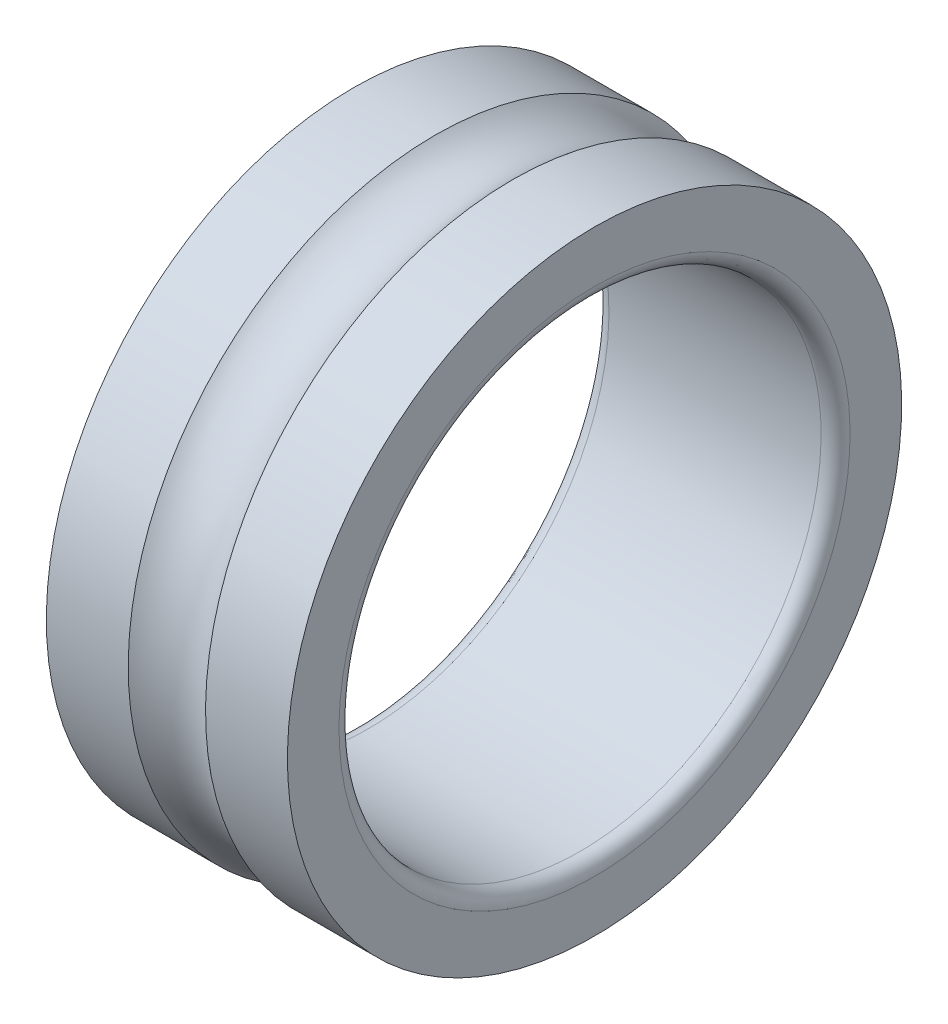
ISO-10303-21;
HEADER;
FILE_DESCRIPTION(('STEP AP214'),'2;1');
FILE_NAME('part.step','',(''),(''),'','','');
FILE_SCHEMA(('AUTOMOTIVE_DESIGN { 1 0 10303 214 1 1 1 1 }'));
ENDSEC;
DATA;
#1=APPLICATION_CONTEXT('core data for automotive mechanical design processes');
#2=APPLICATION_PROTOCOL_DEFINITION('international standard','automotive_design',2000,#1);
#3=PRODUCT_CONTEXT('',#1,'mechanical');
#4=PRODUCT('Part','Part','',(#3));
#5=PRODUCT_RELATED_PRODUCT_CATEGORY('part','',(#4));
#6=PRODUCT_DEFINITION_FORMATION('','',#4);
#7=PRODUCT_DEFINITION_CONTEXT('part definition',#1,'design');
#8=PRODUCT_DEFINITION('design','',#6,#7);
#9=PRODUCT_DEFINITION_SHAPE('','',#8);
#10=(LENGTH_UNIT() NAMED_UNIT(*) SI_UNIT(.MILLI.,.METRE.));
#11=(NAMED_UNIT(*) PLANE_ANGLE_UNIT() SI_UNIT($,.RADIAN.));
#12=(NAMED_UNIT(*) SI_UNIT($,.STERADIAN.) SOLID_ANGLE_UNIT());
#13=UNCERTAINTY_MEASURE_WITH_UNIT(LENGTH_MEASURE(1.E-05),#10,'distance_accuracy_value','');
#14=(GEOMETRIC_REPRESENTATION_CONTEXT(3) GLOBAL_UNCERTAINTY_ASSIGNED_CONTEXT((#13)) GLOBAL_UNIT_ASSIGNED_CONTEXT((#10,
#11,#12)) REPRESENTATION_CONTEXT('',''));
#15=CARTESIAN_POINT('',(0.,0.,0.));
#16=DIRECTION('',(0.,0.,1.));
#17=DIRECTION('',(1.,0.,0.));
#18=AXIS2_PLACEMENT_3D('',#15,#16,#17);
#19=CARTESIAN_POINT('',(4.1509021857012,0.,0.));
#20=DIRECTION('',(-1.,0.,0.));
#21=DIRECTION('',(0.,1.,0.));
#22=AXIS2_PLACEMENT_3D('',#19,#20,#21);
#23=CYLINDRICAL_SURFACE('',#22,6.37);
#24=CARTESIAN_POINT('',(3.30180437140241,0.,0.));
#25=DIRECTION('',(1.,0.,0.));
#26=DIRECTION('',(0.,1.,0.));
#27=AXIS2_PLACEMENT_3D('',#24,#25,#26);
#28=CIRCLE('',#27,6.37);
#29=CARTESIAN_POINT('',(3.30180437140241,6.37,0.));
#30=VERTEX_POINT('',#29);
#31=EDGE_CURVE('E11',#30,#30,#28,.T.);
#32=ORIENTED_EDGE('',*,*,#31,.T.);
#33=EDGE_LOOP('',(#32));
#34=FACE_BOUND('',#33,.T.);
#35=CARTESIAN_POINT('',(5.,0.,0.));
#36=DIRECTION('',(1.,0.,0.));
#37=DIRECTION('',(0.,1.,0.));
#38=AXIS2_PLACEMENT_3D('',#35,#36,#37);
#39=CIRCLE('',#38,6.37);
#40=CARTESIAN_POINT('',(5.,6.37,0.));
#41=VERTEX_POINT('',#40);
#42=EDGE_CURVE('E60',#41,#41,#39,.T.);
#43=ORIENTED_EDGE('',*,*,#42,.F.);
#44=EDGE_LOOP('',(#43));
#45=FACE_BOUND('',#44,.T.);
#46=ADVANCED_FACE('F16',(#34,#45),#23,.T.);
#47=CARTESIAN_POINT('',(2.5,0.,0.));
#48=DIRECTION('',(1.,0.,0.));
#49=DIRECTION('',(0.,0.,-1.));
#50=AXIS2_PLACEMENT_3D('',#47,#48,#49);
#51=TOROIDAL_SURFACE('',#50,7.25,1.1905);
#52=CARTESIAN_POINT('',(1.6981956285976,0.,0.));
#53=DIRECTION('',(1.,0.,0.));
#54=DIRECTION('',(0.,1.,0.));
#55=AXIS2_PLACEMENT_3D('',#52,#53,#54);
#56=CIRCLE('',#55,6.37);
#57=CARTESIAN_POINT('',(1.6981956285976,6.37,0.));
#58=VERTEX_POINT('',#57);
#59=EDGE_CURVE('E26',#58,#58,#56,.T.);
#60=ORIENTED_EDGE('',*,*,#59,.T.);
#61=EDGE_LOOP('',(#60));
#62=FACE_BOUND('',#61,.T.);
#63=ORIENTED_EDGE('',*,*,#31,.F.);
#64=EDGE_LOOP('',(#63));
#65=FACE_BOUND('',#64,.T.);
#66=ADVANCED_FACE('F84',(#62,#65),#51,.F.);
#67=CARTESIAN_POINT('',(0.8490978142988,0.,0.));
#68=DIRECTION('',(-1.,0.,0.));
#69=DIRECTION('',(0.,1.,0.));
#70=AXIS2_PLACEMENT_3D('',#67,#68,#69);
#71=CYLINDRICAL_SURFACE('',#70,6.37);
#72=CARTESIAN_POINT('',(0.,0.,0.));
#73=DIRECTION('',(1.,0.,0.));
#74=DIRECTION('',(0.,1.,0.));
#75=AXIS2_PLACEMENT_3D('',#72,#73,#74);
#76=CIRCLE('',#75,6.37);
#77=CARTESIAN_POINT('',(0.,6.37,0.));
#78=VERTEX_POINT('',#77);
#79=EDGE_CURVE('E58',#78,#78,#76,.T.);
#80=ORIENTED_EDGE('',*,*,#79,.T.);
#81=EDGE_LOOP('',(#80));
#82=FACE_BOUND('',#81,.T.);
#83=ORIENTED_EDGE('',*,*,#59,.F.);
#84=EDGE_LOOP('',(#83));
#85=FACE_BOUND('',#84,.T.);
#86=ADVANCED_FACE('F89',(#82,#85),#71,.T.);
#87=CARTESIAN_POINT('',(0.,5.835,0.));
#88=DIRECTION('',(-1.,0.,0.));
#89=DIRECTION('',(0.,-1.,0.));
#90=AXIS2_PLACEMENT_3D('',#87,#88,#89);
#91=PLANE('',#90);
#92=CARTESIAN_POINT('',(0.,0.,0.));
#93=DIRECTION('',(1.,0.,0.));
#94=DIRECTION('',(0.,1.,0.));
#95=AXIS2_PLACEMENT_3D('',#92,#93,#94);
#96=CIRCLE('',#95,5.3);
#97=CARTESIAN_POINT('',(0.,5.3,0.));
#98=VERTEX_POINT('',#97);
#99=EDGE_CURVE('E57',#98,#98,#96,.T.);
#100=ORIENTED_EDGE('',*,*,#99,.T.);
#101=EDGE_LOOP('',(#100));
#102=FACE_BOUND('',#101,.T.);
#103=ORIENTED_EDGE('',*,*,#79,.F.);
#104=EDGE_LOOP('',(#103));
#105=FACE_BOUND('',#104,.T.);
#106=ADVANCED_FACE('F93',(#102,#105),#91,.T.);
#107=CARTESIAN_POINT('',(0.3,0.,0.));
#108=DIRECTION('',(1.,0.,0.));
#109=DIRECTION('',(0.,0.,-1.));
#110=AXIS2_PLACEMENT_3D('',#107,#108,#109);
#111=TOROIDAL_SURFACE('',#110,5.3,0.3);
#112=CARTESIAN_POINT('',(0.3,0.,0.));
#113=DIRECTION('',(1.,0.,0.));
#114=DIRECTION('',(0.,1.,0.));
#115=AXIS2_PLACEMENT_3D('',#112,#113,#114);
#116=CIRCLE('',#115,5.);
#117=CARTESIAN_POINT('',(0.3,5.,0.));
#118=VERTEX_POINT('',#117);
#119=EDGE_CURVE('E54',#118,#118,#116,.T.);
#120=ORIENTED_EDGE('',*,*,#119,.T.);
#121=EDGE_LOOP('',(#120));
#122=FACE_BOUND('',#121,.T.);
#123=ORIENTED_EDGE('',*,*,#99,.F.);
#124=EDGE_LOOP('',(#123));
#125=FACE_BOUND('',#124,.T.);
#126=ADVANCED_FACE('F18',(#122,#125),#111,.T.);
#127=CARTESIAN_POINT('',(2.5,0.,0.));
#128=DIRECTION('',(-1.,0.,0.));
#129=DIRECTION('',(0.,1.,0.));
#130=AXIS2_PLACEMENT_3D('',#127,#128,#129);
#131=CYLINDRICAL_SURFACE('',#130,5.);
#132=CARTESIAN_POINT('',(4.7,0.,0.));
#133=DIRECTION('',(1.,0.,0.));
#134=DIRECTION('',(0.,1.,0.));
#135=AXIS2_PLACEMENT_3D('',#132,#133,#134);
#136=CIRCLE('',#135,5.);
#137=CARTESIAN_POINT('',(4.7,5.,0.));
#138=VERTEX_POINT('',#137);
#139=EDGE_CURVE('E50',#138,#138,#136,.T.);
#140=ORIENTED_EDGE('',*,*,#139,.T.);
#141=EDGE_LOOP('',(#140));
#142=FACE_BOUND('',#141,.T.);
#143=ORIENTED_EDGE('',*,*,#119,.F.);
#144=EDGE_LOOP('',(#143));
#145=FACE_BOUND('',#144,.T.);
#146=ADVANCED_FACE('F79',(#142,#145),#131,.F.);
#147=CARTESIAN_POINT('',(4.7,0.,0.));
#148=DIRECTION('',(1.,0.,0.));
#149=DIRECTION('',(0.,0.,-1.));
#150=AXIS2_PLACEMENT_3D('',#147,#148,#149);
#151=TOROIDAL_SURFACE('',#150,5.3,0.3);
#152=CARTESIAN_POINT('',(5.,0.,0.));
#153=DIRECTION('',(1.,0.,0.));
#154=DIRECTION('',(0.,1.,0.));
#155=AXIS2_PLACEMENT_3D('',#152,#153,#154);
#156=CIRCLE('',#155,5.3);
#157=CARTESIAN_POINT('',(5.,5.3,0.));
#158=VERTEX_POINT('',#157);
#159=EDGE_CURVE('E20',#158,#158,#156,.T.);
#160=ORIENTED_EDGE('',*,*,#159,.T.);
#161=EDGE_LOOP('',(#160));
#162=FACE_BOUND('',#161,.T.);
#163=ORIENTED_EDGE('',*,*,#139,.F.);
#164=EDGE_LOOP('',(#163));
#165=FACE_BOUND('',#164,.T.);
#166=ADVANCED_FACE('F69',(#162,#165),#151,.T.);
#167=CARTESIAN_POINT('',(5.,5.835,0.));
#168=DIRECTION('',(1.,0.,0.));
#169=DIRECTION('',(0.,1.,0.));
#170=AXIS2_PLACEMENT_3D('',#167,#168,#169);
#171=PLANE('',#170);
#172=ORIENTED_EDGE('',*,*,#42,.T.);
#173=EDGE_LOOP('',(#172));
#174=FACE_BOUND('',#173,.T.);
#175=ORIENTED_EDGE('',*,*,#159,.F.);
#176=EDGE_LOOP('',(#175));
#177=FACE_BOUND('',#176,.T.);
#178=ADVANCED_FACE('F72',(#174,#177),#171,.T.);
#179=CLOSED_SHELL('',(#46,#66,#86,#106,#126,#146,#166,#178));
#180=MANIFOLD_SOLID_BREP('B1',#179);
#181=ADVANCED_BREP_SHAPE_REPRESENTATION('',(#18,#180),#14);
#182=SHAPE_DEFINITION_REPRESENTATION(#9,#181);
ENDSEC;
END-ISO-10303-21;
